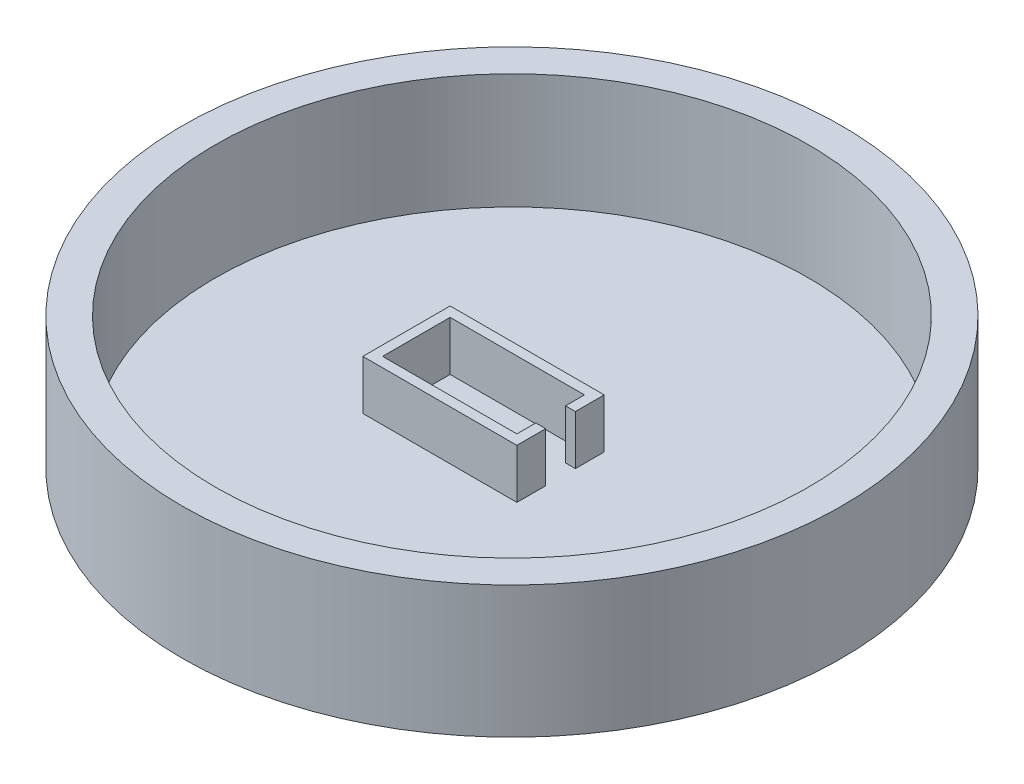
ISO-10303-21;
HEADER;
FILE_DESCRIPTION(('STEP AP214'),'2;1');
FILE_NAME('part.step','',(''),(''),'','','');
FILE_SCHEMA(('AUTOMOTIVE_DESIGN { 1 0 10303 214 1 1 1 1 }'));
ENDSEC;
DATA;
#1=APPLICATION_CONTEXT('core data for automotive mechanical design processes');
#2=APPLICATION_PROTOCOL_DEFINITION('international standard','automotive_design',2000,#1);
#3=PRODUCT_CONTEXT('',#1,'mechanical');
#4=PRODUCT('Part','Part','',(#3));
#5=PRODUCT_RELATED_PRODUCT_CATEGORY('part','',(#4));
#6=PRODUCT_DEFINITION_FORMATION('','',#4);
#7=PRODUCT_DEFINITION_CONTEXT('part definition',#1,'design');
#8=PRODUCT_DEFINITION('design','',#6,#7);
#9=PRODUCT_DEFINITION_SHAPE('','',#8);
#10=(LENGTH_UNIT() NAMED_UNIT(*) SI_UNIT(.MILLI.,.METRE.));
#11=(NAMED_UNIT(*) PLANE_ANGLE_UNIT() SI_UNIT($,.RADIAN.));
#12=(NAMED_UNIT(*) SI_UNIT($,.STERADIAN.) SOLID_ANGLE_UNIT());
#13=UNCERTAINTY_MEASURE_WITH_UNIT(LENGTH_MEASURE(1.E-05),#10,'distance_accuracy_value','');
#14=(GEOMETRIC_REPRESENTATION_CONTEXT(3) GLOBAL_UNCERTAINTY_ASSIGNED_CONTEXT((#13)) GLOBAL_UNIT_ASSIGNED_CONTEXT((#10,
#11,#12)) REPRESENTATION_CONTEXT('',''));
#15=CARTESIAN_POINT('',(0.,0.,0.));
#16=DIRECTION('',(0.,0.,1.));
#17=DIRECTION('',(1.,0.,0.));
#18=AXIS2_PLACEMENT_3D('',#15,#16,#17);
#19=CARTESIAN_POINT('',(14.75,20.,-13.25));
#20=DIRECTION('',(-1.,0.,0.));
#21=DIRECTION('',(0.,0.,1.));
#22=AXIS2_PLACEMENT_3D('',#19,#20,#21);
#23=PLANE('',#22);
#24=DIRECTION('',(0.,0.,-1.));
#25=VECTOR('',#24,1.);
#26=CARTESIAN_POINT('',(14.75,20.,-13.25));
#27=LINE('',#26,#25);
#28=CARTESIAN_POINT('',(14.75,20.,-4.5));
#29=VERTEX_POINT('',#28);
#30=CARTESIAN_POINT('',(14.75,20.,-13.25));
#31=VERTEX_POINT('',#30);
#32=EDGE_CURVE('E203',#29,#31,#27,.T.);
#33=ORIENTED_EDGE('',*,*,#32,.F.);
#34=DIRECTION('',(0.,1.,0.));
#35=VECTOR('',#34,1.);
#36=CARTESIAN_POINT('',(14.75,5.,-4.5));
#37=LINE('',#36,#35);
#38=CARTESIAN_POINT('',(14.75,5.,-4.5));
#39=VERTEX_POINT('',#38);
#40=EDGE_CURVE('E317',#39,#29,#37,.T.);
#41=ORIENTED_EDGE('',*,*,#40,.F.);
#42=DIRECTION('',(0.,0.,-1.));
#43=VECTOR('',#42,1.);
#44=CARTESIAN_POINT('',(14.75,5.,-13.25));
#45=LINE('',#44,#43);
#46=CARTESIAN_POINT('',(14.75,5.,-13.25));
#47=VERTEX_POINT('',#46);
#48=EDGE_CURVE('E218',#39,#47,#45,.T.);
#49=ORIENTED_EDGE('',*,*,#48,.T.);
#50=DIRECTION('',(0.,-1.,0.));
#51=VECTOR('',#50,1.);
#52=CARTESIAN_POINT('',(14.75,20.,-13.25));
#53=LINE('',#52,#51);
#54=EDGE_CURVE('E208',#31,#47,#53,.T.);
#55=ORIENTED_EDGE('',*,*,#54,.F.);
#56=EDGE_LOOP('',(#33,#41,#49,#55));
#57=FACE_BOUND('',#56,.T.);
#58=ADVANCED_FACE('F43',(#57),#23,.F.);
#59=CARTESIAN_POINT('',(11.75,20.,-10.25));
#60=DIRECTION('',(-1.,0.,0.));
#61=DIRECTION('',(0.,0.,1.));
#62=AXIS2_PLACEMENT_3D('',#59,#60,#61);
#63=PLANE('',#62);
#64=DIRECTION('',(0.,1.,0.));
#65=VECTOR('',#64,1.);
#66=CARTESIAN_POINT('',(11.75,5.,-4.49999999999999));
#67=LINE('',#66,#65);
#68=CARTESIAN_POINT('',(11.75,5.,-4.49999999999999));
#69=VERTEX_POINT('',#68);
#70=CARTESIAN_POINT('',(11.75,20.,-4.49999999999999));
#71=VERTEX_POINT('',#70);
#72=EDGE_CURVE('E320',#69,#71,#67,.T.);
#73=ORIENTED_EDGE('',*,*,#72,.T.);
#74=DIRECTION('',(0.,0.,-1.));
#75=VECTOR('',#74,1.);
#76=CARTESIAN_POINT('',(11.75,20.,-10.25));
#77=LINE('',#76,#75);
#78=CARTESIAN_POINT('',(11.75,20.,-10.25));
#79=VERTEX_POINT('',#78);
#80=EDGE_CURVE('E308',#71,#79,#77,.T.);
#81=ORIENTED_EDGE('',*,*,#80,.T.);
#82=DIRECTION('',(0.,-1.,0.));
#83=VECTOR('',#82,1.);
#84=CARTESIAN_POINT('',(11.75,20.,-10.25));
#85=LINE('',#84,#83);
#86=CARTESIAN_POINT('',(11.75,5.,-10.25));
#87=VERTEX_POINT('',#86);
#88=EDGE_CURVE('E184',#79,#87,#85,.T.);
#89=ORIENTED_EDGE('',*,*,#88,.T.);
#90=DIRECTION('',(0.,0.,-1.));
#91=VECTOR('',#90,1.);
#92=CARTESIAN_POINT('',(11.75,5.,-10.25));
#93=LINE('',#92,#91);
#94=EDGE_CURVE('E163',#69,#87,#93,.T.);
#95=ORIENTED_EDGE('',*,*,#94,.F.);
#96=EDGE_LOOP('',(#73,#81,#89,#95));
#97=FACE_BOUND('',#96,.T.);
#98=ADVANCED_FACE('F253',(#97),#63,.T.);
#99=CARTESIAN_POINT('',(0.,40.,0.));
#100=DIRECTION('',(0.,-1.,0.));
#101=DIRECTION('',(0.,0.,-1.));
#102=AXIS2_PLACEMENT_3D('',#99,#100,#101);
#103=CYLINDRICAL_SURFACE('',#102,100.);
#104=CARTESIAN_POINT('',(0.,40.,0.));
#105=DIRECTION('',(0.,1.,0.));
#106=DIRECTION('',(0.,0.,1.));
#107=AXIS2_PLACEMENT_3D('',#104,#105,#106);
#108=CIRCLE('',#107,100.);
#109=CARTESIAN_POINT('',(0.,40.,100.));
#110=VERTEX_POINT('',#109);
#111=EDGE_CURVE('E11',#110,#110,#108,.T.);
#112=ORIENTED_EDGE('',*,*,#111,.F.);
#113=EDGE_LOOP('',(#112));
#114=FACE_BOUND('',#113,.T.);
#115=CARTESIAN_POINT('',(0.,0.,0.));
#116=DIRECTION('',(0.,1.,0.));
#117=DIRECTION('',(0.,0.,1.));
#118=AXIS2_PLACEMENT_3D('',#115,#116,#117);
#119=CIRCLE('',#118,100.);
#120=CARTESIAN_POINT('',(0.,0.,100.));
#121=VERTEX_POINT('',#120);
#122=EDGE_CURVE('E47',#121,#121,#119,.T.);
#123=ORIENTED_EDGE('',*,*,#122,.T.);
#124=EDGE_LOOP('',(#123));
#125=FACE_BOUND('',#124,.T.);
#126=ADVANCED_FACE('F45',(#114,#125),#103,.T.);
#127=CARTESIAN_POINT('',(0.,40.,0.));
#128=DIRECTION('',(0.,1.,0.));
#129=DIRECTION('',(0.,0.,1.));
#130=AXIS2_PLACEMENT_3D('',#127,#128,#129);
#131=PLANE('',#130);
#132=CARTESIAN_POINT('',(0.,40.,0.));
#133=DIRECTION('',(0.,1.,0.));
#134=DIRECTION('',(0.,0.,1.));
#135=AXIS2_PLACEMENT_3D('',#132,#133,#134);
#136=CIRCLE('',#135,90.);
#137=CARTESIAN_POINT('',(0.,40.,90.));
#138=VERTEX_POINT('',#137);
#139=EDGE_CURVE('E233',#138,#138,#136,.T.);
#140=ORIENTED_EDGE('',*,*,#139,.F.);
#141=EDGE_LOOP('',(#140));
#142=FACE_BOUND('',#141,.T.);
#143=ORIENTED_EDGE('',*,*,#111,.T.);
#144=EDGE_LOOP('',(#143));
#145=FACE_BOUND('',#144,.T.);
#146=ADVANCED_FACE('F244',(#142,#145),#131,.T.);
#147=CARTESIAN_POINT('',(0.,0.,0.));
#148=DIRECTION('',(0.,1.,0.));
#149=DIRECTION('',(0.,0.,1.));
#150=AXIS2_PLACEMENT_3D('',#147,#148,#149);
#151=PLANE('',#150);
#152=ORIENTED_EDGE('',*,*,#122,.F.);
#153=EDGE_LOOP('',(#152));
#154=FACE_BOUND('',#153,.T.);
#155=ADVANCED_FACE('F247',(#154),#151,.F.);
#156=CARTESIAN_POINT('',(0.,5.,0.));
#157=DIRECTION('',(0.,1.,0.));
#158=DIRECTION('',(0.,0.,1.));
#159=AXIS2_PLACEMENT_3D('',#156,#157,#158);
#160=CYLINDRICAL_SURFACE('',#159,90.);
#161=CARTESIAN_POINT('',(0.,5.,0.));
#162=DIRECTION('',(0.,1.,0.));
#163=DIRECTION('',(0.,0.,1.));
#164=AXIS2_PLACEMENT_3D('',#161,#162,#163);
#165=CIRCLE('',#164,90.);
#166=CARTESIAN_POINT('',(0.,5.,90.));
#167=VERTEX_POINT('',#166);
#168=EDGE_CURVE('E234',#167,#167,#165,.T.);
#169=ORIENTED_EDGE('',*,*,#168,.F.);
#170=EDGE_LOOP('',(#169));
#171=FACE_BOUND('',#170,.T.);
#172=ORIENTED_EDGE('',*,*,#139,.T.);
#173=EDGE_LOOP('',(#172));
#174=FACE_BOUND('',#173,.T.);
#175=ADVANCED_FACE('F242',(#171,#174),#160,.F.);
#176=CARTESIAN_POINT('',(0.,20.,0.));
#177=DIRECTION('',(0.,-1.,0.));
#178=DIRECTION('',(0.,0.,-1.));
#179=AXIS2_PLACEMENT_3D('',#176,#177,#178);
#180=PLANE('',#179);
#181=ORIENTED_EDGE('',*,*,#80,.F.);
#182=DIRECTION('',(-1.,0.,0.));
#183=VECTOR('',#182,1.);
#184=CARTESIAN_POINT('',(11.75,20.,-4.49999999999999));
#185=LINE('',#184,#183);
#186=EDGE_CURVE('E144',#29,#71,#185,.T.);
#187=ORIENTED_EDGE('',*,*,#186,.F.);
#188=ORIENTED_EDGE('',*,*,#32,.T.);
#189=DIRECTION('',(-1.,0.,0.));
#190=VECTOR('',#189,1.);
#191=CARTESIAN_POINT('',(-32.,20.,-13.25));
#192=LINE('',#191,#190);
#193=CARTESIAN_POINT('',(-32.,20.,-13.25));
#194=VERTEX_POINT('',#193);
#195=EDGE_CURVE('E192',#31,#194,#192,.T.);
#196=ORIENTED_EDGE('',*,*,#195,.T.);
#197=DIRECTION('',(0.,0.,1.));
#198=VECTOR('',#197,1.);
#199=CARTESIAN_POINT('',(-32.,20.,13.25));
#200=LINE('',#199,#198);
#201=CARTESIAN_POINT('',(-32.,20.,13.25));
#202=VERTEX_POINT('',#201);
#203=EDGE_CURVE('E196',#194,#202,#200,.T.);
#204=ORIENTED_EDGE('',*,*,#203,.T.);
#205=DIRECTION('',(1.,0.,0.));
#206=VECTOR('',#205,1.);
#207=CARTESIAN_POINT('',(14.75,20.,13.25));
#208=LINE('',#207,#206);
#209=CARTESIAN_POINT('',(14.75,20.,13.25));
#210=VERTEX_POINT('',#209);
#211=EDGE_CURVE('E200',#202,#210,#208,.T.);
#212=ORIENTED_EDGE('',*,*,#211,.T.);
#213=CARTESIAN_POINT('',(14.75,20.,4.5));
#214=VERTEX_POINT('',#213);
#215=EDGE_CURVE('E204',#210,#214,#27,.T.);
#216=ORIENTED_EDGE('',*,*,#215,.T.);
#217=DIRECTION('',(1.,0.,0.));
#218=VECTOR('',#217,1.);
#219=CARTESIAN_POINT('',(14.75,20.,4.5));
#220=LINE('',#219,#218);
#221=CARTESIAN_POINT('',(11.75,20.,4.5));
#222=VERTEX_POINT('',#221);
#223=EDGE_CURVE('E326',#222,#214,#220,.T.);
#224=ORIENTED_EDGE('',*,*,#223,.F.);
#225=CARTESIAN_POINT('',(11.75,20.,10.25));
#226=VERTEX_POINT('',#225);
#227=EDGE_CURVE('E153',#226,#222,#77,.T.);
#228=ORIENTED_EDGE('',*,*,#227,.F.);
#229=DIRECTION('',(1.,0.,0.));
#230=VECTOR('',#229,1.);
#231=CARTESIAN_POINT('',(0.,20.,10.25));
#232=LINE('',#231,#230);
#233=CARTESIAN_POINT('',(-29.,20.,10.25));
#234=VERTEX_POINT('',#233);
#235=EDGE_CURVE('E174',#234,#226,#232,.T.);
#236=ORIENTED_EDGE('',*,*,#235,.F.);
#237=DIRECTION('',(0.,0.,1.));
#238=VECTOR('',#237,1.);
#239=CARTESIAN_POINT('',(-29.,20.,10.25));
#240=LINE('',#239,#238);
#241=CARTESIAN_POINT('',(-29.,20.,-10.25));
#242=VERTEX_POINT('',#241);
#243=EDGE_CURVE('E180',#242,#234,#240,.T.);
#244=ORIENTED_EDGE('',*,*,#243,.F.);
#245=DIRECTION('',(-1.,0.,0.));
#246=VECTOR('',#245,1.);
#247=CARTESIAN_POINT('',(0.,20.,-10.25));
#248=LINE('',#247,#246);
#249=EDGE_CURVE('E303',#79,#242,#248,.T.);
#250=ORIENTED_EDGE('',*,*,#249,.F.);
#251=EDGE_LOOP('',(#181,#187,#188,#196,#204,#212,#216,#224,#228,#236,#244,#250));
#252=FACE_BOUND('',#251,.T.);
#253=ADVANCED_FACE('F262',(#252),#180,.F.);
#254=CARTESIAN_POINT('',(-32.,20.,-13.25));
#255=DIRECTION('',(0.,0.,1.));
#256=DIRECTION('',(1.,0.,0.));
#257=AXIS2_PLACEMENT_3D('',#254,#255,#256);
#258=PLANE('',#257);
#259=DIRECTION('',(-1.,0.,0.));
#260=VECTOR('',#259,1.);
#261=CARTESIAN_POINT('',(-32.,5.,-13.25));
#262=LINE('',#261,#260);
#263=CARTESIAN_POINT('',(-32.,5.,-13.25));
#264=VERTEX_POINT('',#263);
#265=EDGE_CURVE('E191',#47,#264,#262,.T.);
#266=ORIENTED_EDGE('',*,*,#265,.T.);
#267=DIRECTION('',(0.,-1.,0.));
#268=VECTOR('',#267,1.);
#269=CARTESIAN_POINT('',(-32.,20.,-13.25));
#270=LINE('',#269,#268);
#271=EDGE_CURVE('E230',#194,#264,#270,.T.);
#272=ORIENTED_EDGE('',*,*,#271,.F.);
#273=ORIENTED_EDGE('',*,*,#195,.F.);
#274=ORIENTED_EDGE('',*,*,#54,.T.);
#275=EDGE_LOOP('',(#266,#272,#273,#274));
#276=FACE_BOUND('',#275,.T.);
#277=ADVANCED_FACE('F297',(#276),#258,.F.);
#278=CARTESIAN_POINT('',(-32.,20.,13.25));
#279=DIRECTION('',(1.,0.,0.));
#280=DIRECTION('',(0.,0.,-1.));
#281=AXIS2_PLACEMENT_3D('',#278,#279,#280);
#282=PLANE('',#281);
#283=DIRECTION('',(0.,0.,1.));
#284=VECTOR('',#283,1.);
#285=CARTESIAN_POINT('',(-32.,5.,13.25));
#286=LINE('',#285,#284);
#287=CARTESIAN_POINT('',(-32.,5.,13.25));
#288=VERTEX_POINT('',#287);
#289=EDGE_CURVE('E212',#264,#288,#286,.T.);
#290=ORIENTED_EDGE('',*,*,#289,.T.);
#291=DIRECTION('',(0.,-1.,0.));
#292=VECTOR('',#291,1.);
#293=CARTESIAN_POINT('',(-32.,20.,13.25));
#294=LINE('',#293,#292);
#295=EDGE_CURVE('E226',#202,#288,#294,.T.);
#296=ORIENTED_EDGE('',*,*,#295,.F.);
#297=ORIENTED_EDGE('',*,*,#203,.F.);
#298=ORIENTED_EDGE('',*,*,#271,.T.);
#299=EDGE_LOOP('',(#290,#296,#297,#298));
#300=FACE_BOUND('',#299,.T.);
#301=ADVANCED_FACE('F286',(#300),#282,.F.);
#302=CARTESIAN_POINT('',(14.75,20.,13.25));
#303=DIRECTION('',(0.,0.,-1.));
#304=DIRECTION('',(-1.,0.,0.));
#305=AXIS2_PLACEMENT_3D('',#302,#303,#304);
#306=PLANE('',#305);
#307=DIRECTION('',(1.,0.,0.));
#308=VECTOR('',#307,1.);
#309=CARTESIAN_POINT('',(14.75,5.,13.25));
#310=LINE('',#309,#308);
#311=CARTESIAN_POINT('',(14.75,5.,13.25));
#312=VERTEX_POINT('',#311);
#313=EDGE_CURVE('E215',#288,#312,#310,.T.);
#314=ORIENTED_EDGE('',*,*,#313,.T.);
#315=DIRECTION('',(0.,-1.,0.));
#316=VECTOR('',#315,1.);
#317=CARTESIAN_POINT('',(14.75,20.,13.25));
#318=LINE('',#317,#316);
#319=EDGE_CURVE('E67',#210,#312,#318,.T.);
#320=ORIENTED_EDGE('',*,*,#319,.F.);
#321=ORIENTED_EDGE('',*,*,#211,.F.);
#322=ORIENTED_EDGE('',*,*,#295,.T.);
#323=EDGE_LOOP('',(#314,#320,#321,#322));
#324=FACE_BOUND('',#323,.T.);
#325=ADVANCED_FACE('F279',(#324),#306,.F.);
#326=CARTESIAN_POINT('',(14.75,5.,4.5));
#327=VERTEX_POINT('',#326);
#328=EDGE_CURVE('E197',#312,#327,#45,.T.);
#329=ORIENTED_EDGE('',*,*,#328,.T.);
#330=DIRECTION('',(0.,1.,0.));
#331=VECTOR('',#330,1.);
#332=CARTESIAN_POINT('',(14.75,5.,4.5));
#333=LINE('',#332,#331);
#334=EDGE_CURVE('E140',#327,#214,#333,.T.);
#335=ORIENTED_EDGE('',*,*,#334,.T.);
#336=ORIENTED_EDGE('',*,*,#215,.F.);
#337=ORIENTED_EDGE('',*,*,#319,.T.);
#338=EDGE_LOOP('',(#329,#335,#336,#337));
#339=FACE_BOUND('',#338,.T.);
#340=ADVANCED_FACE('F268',(#339),#23,.F.);
#341=CARTESIAN_POINT('',(11.75,20.,10.25));
#342=DIRECTION('',(0.,0.,-1.));
#343=DIRECTION('',(-1.,0.,0.));
#344=AXIS2_PLACEMENT_3D('',#341,#342,#343);
#345=PLANE('',#344);
#346=DIRECTION('',(1.,0.,0.));
#347=VECTOR('',#346,1.);
#348=CARTESIAN_POINT('',(11.75,5.,10.25));
#349=LINE('',#348,#347);
#350=CARTESIAN_POINT('',(-29.,5.,10.25));
#351=VERTEX_POINT('',#350);
#352=CARTESIAN_POINT('',(11.75,5.,10.25));
#353=VERTEX_POINT('',#352);
#354=EDGE_CURVE('E159',#351,#353,#349,.T.);
#355=ORIENTED_EDGE('',*,*,#354,.F.);
#356=DIRECTION('',(0.,-1.,0.));
#357=VECTOR('',#356,1.);
#358=CARTESIAN_POINT('',(-29.,20.,10.25));
#359=LINE('',#358,#357);
#360=EDGE_CURVE('E175',#234,#351,#359,.T.);
#361=ORIENTED_EDGE('',*,*,#360,.F.);
#362=ORIENTED_EDGE('',*,*,#235,.T.);
#363=DIRECTION('',(0.,-1.,0.));
#364=VECTOR('',#363,1.);
#365=CARTESIAN_POINT('',(11.75,20.,10.25));
#366=LINE('',#365,#364);
#367=EDGE_CURVE('E188',#226,#353,#366,.T.);
#368=ORIENTED_EDGE('',*,*,#367,.T.);
#369=EDGE_LOOP('',(#355,#361,#362,#368));
#370=FACE_BOUND('',#369,.T.);
#371=ADVANCED_FACE('F278',(#370),#345,.T.);
#372=DIRECTION('',(0.,1.,0.));
#373=VECTOR('',#372,1.);
#374=CARTESIAN_POINT('',(11.75,5.,4.5));
#375=LINE('',#374,#373);
#376=CARTESIAN_POINT('',(11.75,5.,4.5));
#377=VERTEX_POINT('',#376);
#378=EDGE_CURVE('E137',#377,#222,#375,.T.);
#379=ORIENTED_EDGE('',*,*,#378,.F.);
#380=EDGE_CURVE('E151',#353,#377,#93,.T.);
#381=ORIENTED_EDGE('',*,*,#380,.F.);
#382=ORIENTED_EDGE('',*,*,#367,.F.);
#383=ORIENTED_EDGE('',*,*,#227,.T.);
#384=EDGE_LOOP('',(#379,#381,#382,#383));
#385=FACE_BOUND('',#384,.T.);
#386=ADVANCED_FACE('F149',(#385),#63,.T.);
#387=CARTESIAN_POINT('',(-29.,20.,-10.25));
#388=DIRECTION('',(0.,0.,1.));
#389=DIRECTION('',(1.,0.,0.));
#390=AXIS2_PLACEMENT_3D('',#387,#388,#389);
#391=PLANE('',#390);
#392=DIRECTION('',(-1.,0.,0.));
#393=VECTOR('',#392,1.);
#394=CARTESIAN_POINT('',(-29.,5.,-10.25));
#395=LINE('',#394,#393);
#396=CARTESIAN_POINT('',(-29.,5.,-10.25));
#397=VERTEX_POINT('',#396);
#398=EDGE_CURVE('E162',#87,#397,#395,.T.);
#399=ORIENTED_EDGE('',*,*,#398,.F.);
#400=ORIENTED_EDGE('',*,*,#88,.F.);
#401=ORIENTED_EDGE('',*,*,#249,.T.);
#402=DIRECTION('',(0.,-1.,0.));
#403=VECTOR('',#402,1.);
#404=CARTESIAN_POINT('',(-29.,20.,-10.25));
#405=LINE('',#404,#403);
#406=EDGE_CURVE('E179',#242,#397,#405,.T.);
#407=ORIENTED_EDGE('',*,*,#406,.T.);
#408=EDGE_LOOP('',(#399,#400,#401,#407));
#409=FACE_BOUND('',#408,.T.);
#410=ADVANCED_FACE('F341',(#409),#391,.T.);
#411=CARTESIAN_POINT('',(-29.,20.,10.25));
#412=DIRECTION('',(1.,0.,0.));
#413=DIRECTION('',(0.,0.,-1.));
#414=AXIS2_PLACEMENT_3D('',#411,#412,#413);
#415=PLANE('',#414);
#416=DIRECTION('',(0.,0.,1.));
#417=VECTOR('',#416,1.);
#418=CARTESIAN_POINT('',(-29.,5.,10.25));
#419=LINE('',#418,#417);
#420=EDGE_CURVE('E167',#397,#351,#419,.T.);
#421=ORIENTED_EDGE('',*,*,#420,.F.);
#422=ORIENTED_EDGE('',*,*,#406,.F.);
#423=ORIENTED_EDGE('',*,*,#243,.T.);
#424=ORIENTED_EDGE('',*,*,#360,.T.);
#425=EDGE_LOOP('',(#421,#422,#423,#424));
#426=FACE_BOUND('',#425,.T.);
#427=ADVANCED_FACE('F346',(#426),#415,.T.);
#428=CARTESIAN_POINT('',(0.,5.,0.));
#429=DIRECTION('',(0.,1.,0.));
#430=DIRECTION('',(0.,0.,1.));
#431=AXIS2_PLACEMENT_3D('',#428,#429,#430);
#432=PLANE('',#431);
#433=ORIENTED_EDGE('',*,*,#354,.T.);
#434=ORIENTED_EDGE('',*,*,#380,.T.);
#435=DIRECTION('',(1.,0.,0.));
#436=VECTOR('',#435,1.);
#437=CARTESIAN_POINT('',(14.75,5.,4.5));
#438=LINE('',#437,#436);
#439=EDGE_CURVE('E134',#377,#327,#438,.T.);
#440=ORIENTED_EDGE('',*,*,#439,.T.);
#441=ORIENTED_EDGE('',*,*,#328,.F.);
#442=ORIENTED_EDGE('',*,*,#313,.F.);
#443=ORIENTED_EDGE('',*,*,#289,.F.);
#444=ORIENTED_EDGE('',*,*,#265,.F.);
#445=ORIENTED_EDGE('',*,*,#48,.F.);
#446=DIRECTION('',(-1.,0.,0.));
#447=VECTOR('',#446,1.);
#448=CARTESIAN_POINT('',(11.75,5.,-4.49999999999999));
#449=LINE('',#448,#447);
#450=EDGE_CURVE('E59',#39,#69,#449,.T.);
#451=ORIENTED_EDGE('',*,*,#450,.T.);
#452=ORIENTED_EDGE('',*,*,#94,.T.);
#453=ORIENTED_EDGE('',*,*,#398,.T.);
#454=ORIENTED_EDGE('',*,*,#420,.T.);
#455=EDGE_LOOP('',(#433,#434,#440,#441,#442,#443,#444,#445,#451,#452,#453,#454));
#456=FACE_BOUND('',#455,.T.);
#457=ORIENTED_EDGE('',*,*,#168,.T.);
#458=EDGE_LOOP('',(#457));
#459=FACE_BOUND('',#458,.T.);
#460=ADVANCED_FACE('F156',(#456,#459),#432,.T.);
#461=CARTESIAN_POINT('',(11.75,5.,-4.49999999999999));
#462=DIRECTION('',(0.,0.,-1.));
#463=DIRECTION('',(-1.,0.,0.));
#464=AXIS2_PLACEMENT_3D('',#461,#462,#463);
#465=PLANE('',#464);
#466=ORIENTED_EDGE('',*,*,#186,.T.);
#467=ORIENTED_EDGE('',*,*,#72,.F.);
#468=ORIENTED_EDGE('',*,*,#450,.F.);
#469=ORIENTED_EDGE('',*,*,#40,.T.);
#470=EDGE_LOOP('',(#466,#467,#468,#469));
#471=FACE_BOUND('',#470,.T.);
#472=ADVANCED_FACE('F336',(#471),#465,.F.);
#473=CARTESIAN_POINT('',(14.75,5.,4.5));
#474=DIRECTION('',(0.,0.,1.));
#475=DIRECTION('',(1.,0.,0.));
#476=AXIS2_PLACEMENT_3D('',#473,#474,#475);
#477=PLANE('',#476);
#478=ORIENTED_EDGE('',*,*,#223,.T.);
#479=ORIENTED_EDGE('',*,*,#334,.F.);
#480=ORIENTED_EDGE('',*,*,#439,.F.);
#481=ORIENTED_EDGE('',*,*,#378,.T.);
#482=EDGE_LOOP('',(#478,#479,#480,#481));
#483=FACE_BOUND('',#482,.T.);
#484=ADVANCED_FACE('F136',(#483),#477,.F.);
#485=CLOSED_SHELL('',(#58,#98,#126,#146,#155,#175,#253,#277,#301,#325,#340,#371,#386,#410,#427,
#460,#472,#484));
#486=MANIFOLD_SOLID_BREP('B2',#485);
#487=ADVANCED_BREP_SHAPE_REPRESENTATION('',(#18,#486),#14);
#488=SHAPE_DEFINITION_REPRESENTATION(#9,#487);
ENDSEC;
END-ISO-10303-21;
